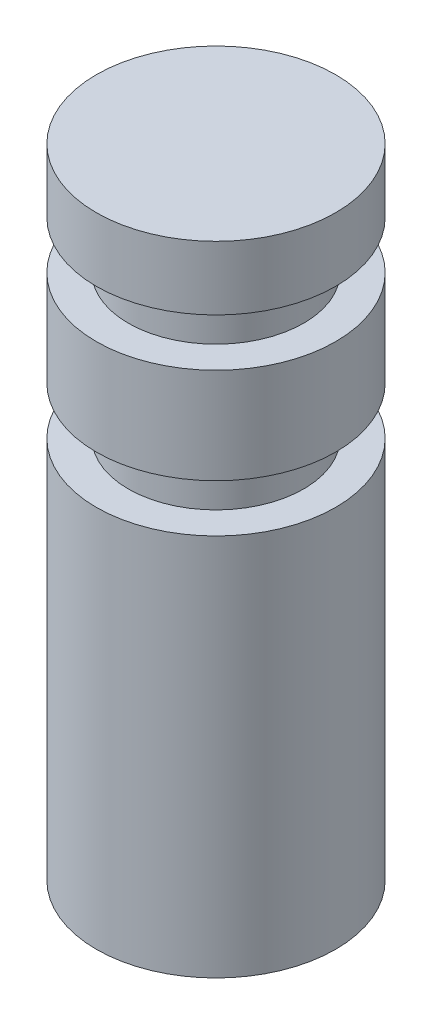
ISO-10303-21;
HEADER;
FILE_DESCRIPTION(('STEP AP214'),'2;1');
FILE_NAME('part.step','',(''),(''),'','','');
FILE_SCHEMA(('AUTOMOTIVE_DESIGN { 1 0 10303 214 1 1 1 1 }'));
ENDSEC;
DATA;
#1=APPLICATION_CONTEXT('core data for automotive mechanical design processes');
#2=APPLICATION_PROTOCOL_DEFINITION('international standard','automotive_design',2000,#1);
#3=PRODUCT_CONTEXT('',#1,'mechanical');
#4=PRODUCT('Part','Part','',(#3));
#5=PRODUCT_RELATED_PRODUCT_CATEGORY('part','',(#4));
#6=PRODUCT_DEFINITION_FORMATION('','',#4);
#7=PRODUCT_DEFINITION_CONTEXT('part definition',#1,'design');
#8=PRODUCT_DEFINITION('design','',#6,#7);
#9=PRODUCT_DEFINITION_SHAPE('','',#8);
#10=(LENGTH_UNIT() NAMED_UNIT(*) SI_UNIT(.MILLI.,.METRE.));
#11=(NAMED_UNIT(*) PLANE_ANGLE_UNIT() SI_UNIT($,.RADIAN.));
#12=(NAMED_UNIT(*) SI_UNIT($,.STERADIAN.) SOLID_ANGLE_UNIT());
#13=UNCERTAINTY_MEASURE_WITH_UNIT(LENGTH_MEASURE(1.E-05),#10,'distance_accuracy_value','');
#14=(GEOMETRIC_REPRESENTATION_CONTEXT(3) GLOBAL_UNCERTAINTY_ASSIGNED_CONTEXT((#13)) GLOBAL_UNIT_ASSIGNED_CONTEXT((#10,
#11,#12)) REPRESENTATION_CONTEXT('',''));
#15=CARTESIAN_POINT('',(0.,0.,0.));
#16=DIRECTION('',(0.,0.,1.));
#17=DIRECTION('',(1.,0.,0.));
#18=AXIS2_PLACEMENT_3D('',#15,#16,#17);
#19=CARTESIAN_POINT('',(0.,25.4,0.));
#20=DIRECTION('',(0.,-1.,0.));
#21=DIRECTION('',(0.,0.,-1.));
#22=AXIS2_PLACEMENT_3D('',#19,#20,#21);
#23=CYLINDRICAL_SURFACE('',#22,4.7625);
#24=CARTESIAN_POINT('',(0.,20.955,0.));
#25=DIRECTION('',(0.,1.,0.));
#26=DIRECTION('',(0.,0.,1.));
#27=AXIS2_PLACEMENT_3D('',#24,#25,#26);
#28=CIRCLE('',#27,4.7625);
#29=CARTESIAN_POINT('',(0.,20.955,4.7625));
#30=VERTEX_POINT('',#29);
#31=EDGE_CURVE('E44',#30,#30,#28,.T.);
#32=ORIENTED_EDGE('',*,*,#31,.F.);
#33=EDGE_LOOP('',(#32));
#34=FACE_BOUND('',#33,.T.);
#35=CARTESIAN_POINT('',(0.,17.145,0.));
#36=DIRECTION('',(0.,-1.,0.));
#37=DIRECTION('',(0.,0.,-1.));
#38=AXIS2_PLACEMENT_3D('',#35,#36,#37);
#39=CIRCLE('',#38,4.7625);
#40=CARTESIAN_POINT('',(0.,17.145,-4.7625));
#41=VERTEX_POINT('',#40);
#42=EDGE_CURVE('E54',#41,#41,#39,.T.);
#43=ORIENTED_EDGE('',*,*,#42,.F.);
#44=EDGE_LOOP('',(#43));
#45=FACE_BOUND('',#44,.T.);
#46=ADVANCED_FACE('F31',(#34,#45),#23,.T.);
#47=CARTESIAN_POINT('',(0.,20.955,-6.0325));
#48=DIRECTION('',(0.,1.,0.));
#49=DIRECTION('',(0.,0.,1.));
#50=AXIS2_PLACEMENT_3D('',#47,#48,#49);
#51=PLANE('',#50);
#52=CARTESIAN_POINT('',(0.,20.955,0.));
#53=DIRECTION('',(0.,1.,0.));
#54=DIRECTION('',(0.,0.,1.));
#55=AXIS2_PLACEMENT_3D('',#52,#53,#54);
#56=CIRCLE('',#55,3.4925);
#57=CARTESIAN_POINT('',(0.,20.955,3.4925));
#58=VERTEX_POINT('',#57);
#59=EDGE_CURVE('E47',#58,#58,#56,.T.);
#60=ORIENTED_EDGE('',*,*,#59,.F.);
#61=EDGE_LOOP('',(#60));
#62=FACE_BOUND('',#61,.T.);
#63=ORIENTED_EDGE('',*,*,#31,.T.);
#64=EDGE_LOOP('',(#63));
#65=FACE_BOUND('',#64,.T.);
#66=ADVANCED_FACE('F77',(#62,#65),#51,.T.);
#67=CARTESIAN_POINT('',(0.,22.86,-6.0325));
#68=DIRECTION('',(0.,-1.,0.));
#69=DIRECTION('',(0.,0.,-1.));
#70=AXIS2_PLACEMENT_3D('',#67,#68,#69);
#71=PLANE('',#70);
#72=CARTESIAN_POINT('',(0.,22.86,0.));
#73=DIRECTION('',(0.,1.,0.));
#74=DIRECTION('',(0.,0.,1.));
#75=AXIS2_PLACEMENT_3D('',#72,#73,#74);
#76=CIRCLE('',#75,3.4925);
#77=CARTESIAN_POINT('',(0.,22.86,3.4925));
#78=VERTEX_POINT('',#77);
#79=EDGE_CURVE('E60',#78,#78,#76,.T.);
#80=ORIENTED_EDGE('',*,*,#79,.T.);
#81=EDGE_LOOP('',(#80));
#82=FACE_BOUND('',#81,.T.);
#83=CARTESIAN_POINT('',(0.,22.86,0.));
#84=DIRECTION('',(0.,-1.,0.));
#85=DIRECTION('',(0.,0.,-1.));
#86=AXIS2_PLACEMENT_3D('',#83,#84,#85);
#87=CIRCLE('',#86,4.7625);
#88=CARTESIAN_POINT('',(0.,22.86,-4.7625));
#89=VERTEX_POINT('',#88);
#90=EDGE_CURVE('E50',#89,#89,#87,.T.);
#91=ORIENTED_EDGE('',*,*,#90,.T.);
#92=EDGE_LOOP('',(#91));
#93=FACE_BOUND('',#92,.T.);
#94=ADVANCED_FACE('F80',(#82,#93),#71,.T.);
#95=CARTESIAN_POINT('',(0.,25.4,0.));
#96=DIRECTION('',(0.,1.,0.));
#97=DIRECTION('',(0.,0.,1.));
#98=AXIS2_PLACEMENT_3D('',#95,#96,#97);
#99=CYLINDRICAL_SURFACE('',#98,3.4925);
#100=ORIENTED_EDGE('',*,*,#59,.T.);
#101=EDGE_LOOP('',(#100));
#102=FACE_BOUND('',#101,.T.);
#103=ORIENTED_EDGE('',*,*,#79,.F.);
#104=EDGE_LOOP('',(#103));
#105=FACE_BOUND('',#104,.T.);
#106=ADVANCED_FACE('F74',(#102,#105),#99,.T.);
#107=CARTESIAN_POINT('',(0.,25.4,0.));
#108=DIRECTION('',(0.,1.,0.));
#109=DIRECTION('',(0.,0.,1.));
#110=AXIS2_PLACEMENT_3D('',#107,#108,#109);
#111=PLANE('',#110);
#112=CARTESIAN_POINT('',(0.,25.4,0.));
#113=DIRECTION('',(0.,1.,0.));
#114=DIRECTION('',(0.,0.,1.));
#115=AXIS2_PLACEMENT_3D('',#112,#113,#114);
#116=CIRCLE('',#115,4.7625);
#117=CARTESIAN_POINT('',(0.,25.4,4.7625));
#118=VERTEX_POINT('',#117);
#119=EDGE_CURVE('E10',#118,#118,#116,.T.);
#120=ORIENTED_EDGE('',*,*,#119,.T.);
#121=EDGE_LOOP('',(#120));
#122=FACE_BOUND('',#121,.T.);
#123=ADVANCED_FACE('F91',(#122),#111,.T.);
#124=ORIENTED_EDGE('',*,*,#119,.F.);
#125=EDGE_LOOP('',(#124));
#126=FACE_BOUND('',#125,.T.);
#127=ORIENTED_EDGE('',*,*,#90,.F.);
#128=EDGE_LOOP('',(#127));
#129=FACE_BOUND('',#128,.T.);
#130=ADVANCED_FACE('F86',(#126,#129),#23,.T.);
#131=CARTESIAN_POINT('',(0.,15.24,-6.0325));
#132=DIRECTION('',(0.,1.,0.));
#133=DIRECTION('',(0.,0.,1.));
#134=AXIS2_PLACEMENT_3D('',#131,#132,#133);
#135=PLANE('',#134);
#136=CARTESIAN_POINT('',(0.,15.24,0.));
#137=DIRECTION('',(0.,1.,0.));
#138=DIRECTION('',(0.,0.,1.));
#139=AXIS2_PLACEMENT_3D('',#136,#137,#138);
#140=CIRCLE('',#139,3.4925);
#141=CARTESIAN_POINT('',(0.,15.24,3.4925));
#142=VERTEX_POINT('',#141);
#143=EDGE_CURVE('E56',#142,#142,#140,.T.);
#144=ORIENTED_EDGE('',*,*,#143,.F.);
#145=EDGE_LOOP('',(#144));
#146=FACE_BOUND('',#145,.T.);
#147=CARTESIAN_POINT('',(0.,15.24,0.));
#148=DIRECTION('',(0.,1.,0.));
#149=DIRECTION('',(0.,0.,1.));
#150=AXIS2_PLACEMENT_3D('',#147,#148,#149);
#151=CIRCLE('',#150,4.7625);
#152=CARTESIAN_POINT('',(0.,15.24,4.7625));
#153=VERTEX_POINT('',#152);
#154=EDGE_CURVE('E35',#153,#153,#151,.T.);
#155=ORIENTED_EDGE('',*,*,#154,.T.);
#156=EDGE_LOOP('',(#155));
#157=FACE_BOUND('',#156,.T.);
#158=ADVANCED_FACE('F90',(#146,#157),#135,.T.);
#159=CARTESIAN_POINT('',(0.,17.145,-6.0325));
#160=DIRECTION('',(0.,-1.,0.));
#161=DIRECTION('',(0.,0.,-1.));
#162=AXIS2_PLACEMENT_3D('',#159,#160,#161);
#163=PLANE('',#162);
#164=CARTESIAN_POINT('',(0.,17.145,0.));
#165=DIRECTION('',(0.,1.,0.));
#166=DIRECTION('',(0.,0.,1.));
#167=AXIS2_PLACEMENT_3D('',#164,#165,#166);
#168=CIRCLE('',#167,3.4925);
#169=CARTESIAN_POINT('',(0.,17.145,3.4925));
#170=VERTEX_POINT('',#169);
#171=EDGE_CURVE('E62',#170,#170,#168,.T.);
#172=ORIENTED_EDGE('',*,*,#171,.T.);
#173=EDGE_LOOP('',(#172));
#174=FACE_BOUND('',#173,.T.);
#175=ORIENTED_EDGE('',*,*,#42,.T.);
#176=EDGE_LOOP('',(#175));
#177=FACE_BOUND('',#176,.T.);
#178=ADVANCED_FACE('F106',(#174,#177),#163,.T.);
#179=CARTESIAN_POINT('',(0.,25.4,0.));
#180=DIRECTION('',(0.,1.,0.));
#181=DIRECTION('',(0.,0.,1.));
#182=AXIS2_PLACEMENT_3D('',#179,#180,#181);
#183=CYLINDRICAL_SURFACE('',#182,3.4925);
#184=ORIENTED_EDGE('',*,*,#143,.T.);
#185=EDGE_LOOP('',(#184));
#186=FACE_BOUND('',#185,.T.);
#187=ORIENTED_EDGE('',*,*,#171,.F.);
#188=EDGE_LOOP('',(#187));
#189=FACE_BOUND('',#188,.T.);
#190=ADVANCED_FACE('F99',(#186,#189),#183,.T.);
#191=CARTESIAN_POINT('',(0.,0.,0.));
#192=DIRECTION('',(0.,1.,0.));
#193=DIRECTION('',(0.,0.,1.));
#194=AXIS2_PLACEMENT_3D('',#191,#192,#193);
#195=PLANE('',#194);
#196=CARTESIAN_POINT('',(0.,0.,0.));
#197=DIRECTION('',(0.,1.,0.));
#198=DIRECTION('',(0.,0.,1.));
#199=AXIS2_PLACEMENT_3D('',#196,#197,#198);
#200=CIRCLE('',#199,4.7625);
#201=CARTESIAN_POINT('',(0.,0.,4.7625));
#202=VERTEX_POINT('',#201);
#203=EDGE_CURVE('E39',#202,#202,#200,.T.);
#204=ORIENTED_EDGE('',*,*,#203,.F.);
#205=EDGE_LOOP('',(#204));
#206=FACE_BOUND('',#205,.T.);
#207=ADVANCED_FACE('F94',(#206),#195,.F.);
#208=ORIENTED_EDGE('',*,*,#203,.T.);
#209=EDGE_LOOP('',(#208));
#210=FACE_BOUND('',#209,.T.);
#211=ORIENTED_EDGE('',*,*,#154,.F.);
#212=EDGE_LOOP('',(#211));
#213=FACE_BOUND('',#212,.T.);
#214=ADVANCED_FACE('F33',(#210,#213),#23,.T.);
#215=CLOSED_SHELL('',(#46,#66,#94,#106,#123,#130,#158,#178,#190,#207,#214));
#216=MANIFOLD_SOLID_BREP('B2',#215);
#217=ADVANCED_BREP_SHAPE_REPRESENTATION('',(#18,#216),#14);
#218=SHAPE_DEFINITION_REPRESENTATION(#9,#217);
ENDSEC;
END-ISO-10303-21;
